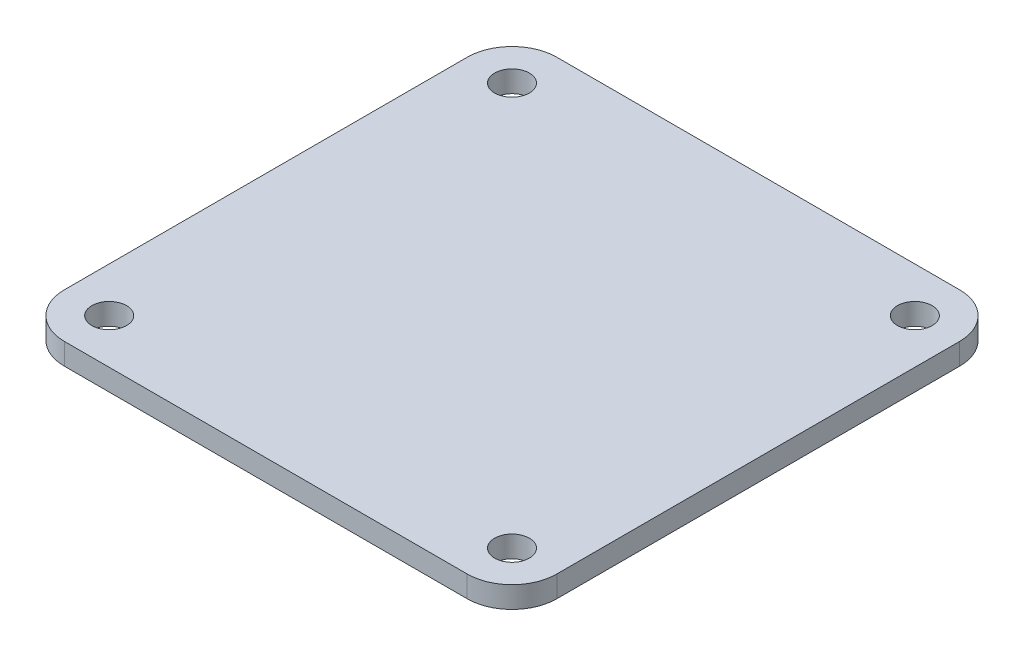
ISO-10303-21;
HEADER;
FILE_DESCRIPTION(('STEP AP214'),'2;1');
FILE_NAME('part.step','',(''),(''),'','','');
FILE_SCHEMA(('AUTOMOTIVE_DESIGN { 1 0 10303 214 1 1 1 1 }'));
ENDSEC;
DATA;
#1=APPLICATION_CONTEXT('core data for automotive mechanical design processes');
#2=APPLICATION_PROTOCOL_DEFINITION('international standard','automotive_design',2000,#1);
#3=PRODUCT_CONTEXT('',#1,'mechanical');
#4=PRODUCT('Part','Part','',(#3));
#5=PRODUCT_RELATED_PRODUCT_CATEGORY('part','',(#4));
#6=PRODUCT_DEFINITION_FORMATION('','',#4);
#7=PRODUCT_DEFINITION_CONTEXT('part definition',#1,'design');
#8=PRODUCT_DEFINITION('design','',#6,#7);
#9=PRODUCT_DEFINITION_SHAPE('','',#8);
#10=(LENGTH_UNIT() NAMED_UNIT(*) SI_UNIT(.MILLI.,.METRE.));
#11=(NAMED_UNIT(*) PLANE_ANGLE_UNIT() SI_UNIT($,.RADIAN.));
#12=(NAMED_UNIT(*) SI_UNIT($,.STERADIAN.) SOLID_ANGLE_UNIT());
#13=UNCERTAINTY_MEASURE_WITH_UNIT(LENGTH_MEASURE(1.E-05),#10,'distance_accuracy_value','');
#14=(GEOMETRIC_REPRESENTATION_CONTEXT(3) GLOBAL_UNCERTAINTY_ASSIGNED_CONTEXT((#13)) GLOBAL_UNIT_ASSIGNED_CONTEXT((#10,
#11,#12)) REPRESENTATION_CONTEXT('',''));
#15=CARTESIAN_POINT('',(0.,0.,0.));
#16=DIRECTION('',(0.,0.,1.));
#17=DIRECTION('',(1.,0.,0.));
#18=AXIS2_PLACEMENT_3D('',#15,#16,#17);
#19=CARTESIAN_POINT('',(0.,3.048,0.));
#20=DIRECTION('',(1.,0.,0.));
#21=DIRECTION('',(0.,0.,-1.));
#22=AXIS2_PLACEMENT_3D('',#19,#20,#21);
#23=PLANE('',#22);
#24=DIRECTION('',(0.,0.,1.));
#25=VECTOR('',#24,1.);
#26=CARTESIAN_POINT('',(0.,3.048,0.));
#27=LINE('',#26,#25);
#28=CARTESIAN_POINT('',(0.,3.048,-63.5));
#29=VERTEX_POINT('',#28);
#30=CARTESIAN_POINT('',(0.,3.048,-6.35));
#31=VERTEX_POINT('',#30);
#32=EDGE_CURVE('E117',#29,#31,#27,.T.);
#33=ORIENTED_EDGE('',*,*,#32,.F.);
#34=DIRECTION('',(0.,-1.,0.));
#35=VECTOR('',#34,1.);
#36=CARTESIAN_POINT('',(0.,3.048,-63.5));
#37=LINE('',#36,#35);
#38=CARTESIAN_POINT('',(0.,0.,-63.5));
#39=VERTEX_POINT('',#38);
#40=EDGE_CURVE('E102',#29,#39,#37,.T.);
#41=ORIENTED_EDGE('',*,*,#40,.T.);
#42=DIRECTION('',(0.,0.,1.));
#43=VECTOR('',#42,1.);
#44=CARTESIAN_POINT('',(0.,0.,0.));
#45=LINE('',#44,#43);
#46=CARTESIAN_POINT('',(0.,0.,-6.35));
#47=VERTEX_POINT('',#46);
#48=EDGE_CURVE('E114',#39,#47,#45,.T.);
#49=ORIENTED_EDGE('',*,*,#48,.T.);
#50=DIRECTION('',(0.,-1.,0.));
#51=VECTOR('',#50,1.);
#52=CARTESIAN_POINT('',(0.,3.048,-6.35));
#53=LINE('',#52,#51);
#54=EDGE_CURVE('E119',#47,#31,#53,.F.);
#55=ORIENTED_EDGE('',*,*,#54,.T.);
#56=EDGE_LOOP('',(#33,#41,#49,#55));
#57=FACE_BOUND('',#56,.T.);
#58=ADVANCED_FACE('F33',(#57),#23,.F.);
#59=CARTESIAN_POINT('',(0.,3.048,0.));
#60=DIRECTION('',(0.,0.,-1.));
#61=DIRECTION('',(-1.,0.,0.));
#62=AXIS2_PLACEMENT_3D('',#59,#60,#61);
#63=PLANE('',#62);
#64=DIRECTION('',(1.,0.,0.));
#65=VECTOR('',#64,1.);
#66=CARTESIAN_POINT('',(0.,3.048,0.));
#67=LINE('',#66,#65);
#68=CARTESIAN_POINT('',(6.35,3.048,0.));
#69=VERTEX_POINT('',#68);
#70=CARTESIAN_POINT('',(63.5,3.048,0.));
#71=VERTEX_POINT('',#70);
#72=EDGE_CURVE('E172',#69,#71,#67,.T.);
#73=ORIENTED_EDGE('',*,*,#72,.F.);
#74=DIRECTION('',(0.,-1.,0.));
#75=VECTOR('',#74,1.);
#76=CARTESIAN_POINT('',(6.35,3.048,0.));
#77=LINE('',#76,#75);
#78=CARTESIAN_POINT('',(6.35,0.,0.));
#79=VERTEX_POINT('',#78);
#80=EDGE_CURVE('E156',#69,#79,#77,.T.);
#81=ORIENTED_EDGE('',*,*,#80,.T.);
#82=DIRECTION('',(1.,0.,0.));
#83=VECTOR('',#82,1.);
#84=CARTESIAN_POINT('',(0.,0.,0.));
#85=LINE('',#84,#83);
#86=CARTESIAN_POINT('',(63.5,0.,0.));
#87=VERTEX_POINT('',#86);
#88=EDGE_CURVE('E123',#79,#87,#85,.T.);
#89=ORIENTED_EDGE('',*,*,#88,.T.);
#90=DIRECTION('',(0.,-1.,0.));
#91=VECTOR('',#90,1.);
#92=CARTESIAN_POINT('',(63.5,3.048,0.));
#93=LINE('',#92,#91);
#94=EDGE_CURVE('E154',#87,#71,#93,.F.);
#95=ORIENTED_EDGE('',*,*,#94,.T.);
#96=EDGE_LOOP('',(#73,#81,#89,#95));
#97=FACE_BOUND('',#96,.T.);
#98=ADVANCED_FACE('F221',(#97),#63,.F.);
#99=CARTESIAN_POINT('',(69.85,3.048,0.));
#100=DIRECTION('',(-1.,0.,0.));
#101=DIRECTION('',(0.,0.,1.));
#102=AXIS2_PLACEMENT_3D('',#99,#100,#101);
#103=PLANE('',#102);
#104=DIRECTION('',(0.,0.,-1.));
#105=VECTOR('',#104,1.);
#106=CARTESIAN_POINT('',(69.85,0.,0.));
#107=LINE('',#106,#105);
#108=CARTESIAN_POINT('',(69.85,0.,-6.35));
#109=VERTEX_POINT('',#108);
#110=CARTESIAN_POINT('',(69.85,0.,-63.5));
#111=VERTEX_POINT('',#110);
#112=EDGE_CURVE('E127',#109,#111,#107,.T.);
#113=ORIENTED_EDGE('',*,*,#112,.T.);
#114=DIRECTION('',(0.,-1.,0.));
#115=VECTOR('',#114,1.);
#116=CARTESIAN_POINT('',(69.85,3.048,-63.5));
#117=LINE('',#116,#115);
#118=CARTESIAN_POINT('',(69.85,3.048,-63.5));
#119=VERTEX_POINT('',#118);
#120=EDGE_CURVE('E11',#111,#119,#117,.F.);
#121=ORIENTED_EDGE('',*,*,#120,.T.);
#122=DIRECTION('',(0.,0.,-1.));
#123=VECTOR('',#122,1.);
#124=CARTESIAN_POINT('',(69.85,3.048,0.));
#125=LINE('',#124,#123);
#126=CARTESIAN_POINT('',(69.85,3.048,-6.35));
#127=VERTEX_POINT('',#126);
#128=EDGE_CURVE('E162',#127,#119,#125,.T.);
#129=ORIENTED_EDGE('',*,*,#128,.F.);
#130=DIRECTION('',(0.,-1.,0.));
#131=VECTOR('',#130,1.);
#132=CARTESIAN_POINT('',(69.85,3.048,-6.35));
#133=LINE('',#132,#131);
#134=EDGE_CURVE('E41',#127,#109,#133,.T.);
#135=ORIENTED_EDGE('',*,*,#134,.T.);
#136=EDGE_LOOP('',(#113,#121,#129,#135));
#137=FACE_BOUND('',#136,.T.);
#138=ADVANCED_FACE('F161',(#137),#103,.F.);
#139=CARTESIAN_POINT('',(0.,3.048,-69.85));
#140=DIRECTION('',(0.,0.,1.));
#141=DIRECTION('',(1.,0.,0.));
#142=AXIS2_PLACEMENT_3D('',#139,#140,#141);
#143=PLANE('',#142);
#144=DIRECTION('',(-1.,0.,0.));
#145=VECTOR('',#144,1.);
#146=CARTESIAN_POINT('',(0.,0.,-69.85));
#147=LINE('',#146,#145);
#148=CARTESIAN_POINT('',(63.5,0.,-69.85));
#149=VERTEX_POINT('',#148);
#150=CARTESIAN_POINT('',(6.35,0.,-69.85));
#151=VERTEX_POINT('',#150);
#152=EDGE_CURVE('E137',#149,#151,#147,.T.);
#153=ORIENTED_EDGE('',*,*,#152,.T.);
#154=DIRECTION('',(0.,-1.,0.));
#155=VECTOR('',#154,1.);
#156=CARTESIAN_POINT('',(6.35,3.048,-69.85));
#157=LINE('',#156,#155);
#158=CARTESIAN_POINT('',(6.35,3.048,-69.85));
#159=VERTEX_POINT('',#158);
#160=EDGE_CURVE('E103',#151,#159,#157,.F.);
#161=ORIENTED_EDGE('',*,*,#160,.T.);
#162=DIRECTION('',(-1.,0.,0.));
#163=VECTOR('',#162,1.);
#164=CARTESIAN_POINT('',(0.,3.048,-69.85));
#165=LINE('',#164,#163);
#166=CARTESIAN_POINT('',(63.5,3.048,-69.85));
#167=VERTEX_POINT('',#166);
#168=EDGE_CURVE('E133',#167,#159,#165,.T.);
#169=ORIENTED_EDGE('',*,*,#168,.F.);
#170=DIRECTION('',(0.,-1.,0.));
#171=VECTOR('',#170,1.);
#172=CARTESIAN_POINT('',(63.5,3.048,-69.85));
#173=LINE('',#172,#171);
#174=EDGE_CURVE('E108',#167,#149,#173,.T.);
#175=ORIENTED_EDGE('',*,*,#174,.T.);
#176=EDGE_LOOP('',(#153,#161,#169,#175));
#177=FACE_BOUND('',#176,.T.);
#178=ADVANCED_FACE('F170',(#177),#143,.F.);
#179=CARTESIAN_POINT('',(0.,3.048,0.));
#180=DIRECTION('',(0.,-1.,0.));
#181=DIRECTION('',(0.,0.,-1.));
#182=AXIS2_PLACEMENT_3D('',#179,#180,#181);
#183=PLANE('',#182);
#184=CARTESIAN_POINT('',(63.5,3.048,-6.35));
#185=DIRECTION('',(0.,1.,0.));
#186=DIRECTION('',(0.,0.,1.));
#187=AXIS2_PLACEMENT_3D('',#184,#185,#186);
#188=CIRCLE('',#187,2.45998999999999);
#189=CARTESIAN_POINT('',(63.5,3.048,-8.80998999999999));
#190=VERTEX_POINT('',#189);
#191=EDGE_CURVE('E177',#190,#190,#188,.T.);
#192=ORIENTED_EDGE('',*,*,#191,.F.);
#193=EDGE_LOOP('',(#192));
#194=FACE_BOUND('',#193,.T.);
#195=CARTESIAN_POINT('',(6.35,3.048,-63.5));
#196=DIRECTION('',(0.,1.,0.));
#197=DIRECTION('',(0.,0.,1.));
#198=AXIS2_PLACEMENT_3D('',#195,#196,#197);
#199=CIRCLE('',#198,2.45999);
#200=CARTESIAN_POINT('',(6.35,3.048,-65.95999));
#201=VERTEX_POINT('',#200);
#202=EDGE_CURVE('E182',#201,#201,#199,.T.);
#203=ORIENTED_EDGE('',*,*,#202,.F.);
#204=EDGE_LOOP('',(#203));
#205=FACE_BOUND('',#204,.T.);
#206=CARTESIAN_POINT('',(63.5,3.048,-63.5));
#207=DIRECTION('',(0.,1.,0.));
#208=DIRECTION('',(0.,0.,1.));
#209=AXIS2_PLACEMENT_3D('',#206,#207,#208);
#210=CIRCLE('',#209,2.45998999999999);
#211=CARTESIAN_POINT('',(63.5,3.048,-65.95999));
#212=VERTEX_POINT('',#211);
#213=EDGE_CURVE('E183',#212,#212,#210,.T.);
#214=ORIENTED_EDGE('',*,*,#213,.F.);
#215=EDGE_LOOP('',(#214));
#216=FACE_BOUND('',#215,.T.);
#217=CARTESIAN_POINT('',(6.35,3.048,-6.35));
#218=DIRECTION('',(0.,1.,0.));
#219=DIRECTION('',(0.,0.,1.));
#220=AXIS2_PLACEMENT_3D('',#217,#218,#219);
#221=CIRCLE('',#220,2.45999);
#222=CARTESIAN_POINT('',(6.35,3.048,-8.80999));
#223=VERTEX_POINT('',#222);
#224=EDGE_CURVE('E124',#223,#223,#221,.T.);
#225=ORIENTED_EDGE('',*,*,#224,.F.);
#226=EDGE_LOOP('',(#225));
#227=FACE_BOUND('',#226,.T.);
#228=ORIENTED_EDGE('',*,*,#168,.T.);
#229=CARTESIAN_POINT('',(6.35,3.048,-63.5));
#230=DIRECTION('',(0.,-1.,0.));
#231=DIRECTION('',(0.,0.,-1.));
#232=AXIS2_PLACEMENT_3D('',#229,#230,#231);
#233=CIRCLE('',#232,6.35);
#234=EDGE_CURVE('E152',#159,#29,#233,.F.);
#235=ORIENTED_EDGE('',*,*,#234,.T.);
#236=ORIENTED_EDGE('',*,*,#32,.T.);
#237=CARTESIAN_POINT('',(6.35,3.048,-6.35));
#238=DIRECTION('',(0.,-1.,0.));
#239=DIRECTION('',(0.,0.,-1.));
#240=AXIS2_PLACEMENT_3D('',#237,#238,#239);
#241=CIRCLE('',#240,6.35);
#242=EDGE_CURVE('E150',#31,#69,#241,.F.);
#243=ORIENTED_EDGE('',*,*,#242,.T.);
#244=ORIENTED_EDGE('',*,*,#72,.T.);
#245=CARTESIAN_POINT('',(63.5,3.048,-6.35));
#246=DIRECTION('',(0.,-1.,0.));
#247=DIRECTION('',(0.,0.,-1.));
#248=AXIS2_PLACEMENT_3D('',#245,#246,#247);
#249=CIRCLE('',#248,6.35);
#250=EDGE_CURVE('E53',#71,#127,#249,.F.);
#251=ORIENTED_EDGE('',*,*,#250,.T.);
#252=ORIENTED_EDGE('',*,*,#128,.T.);
#253=CARTESIAN_POINT('',(63.5,3.048,-63.5));
#254=DIRECTION('',(0.,-1.,0.));
#255=DIRECTION('',(0.,0.,-1.));
#256=AXIS2_PLACEMENT_3D('',#253,#254,#255);
#257=CIRCLE('',#256,6.35);
#258=EDGE_CURVE('E148',#119,#167,#257,.F.);
#259=ORIENTED_EDGE('',*,*,#258,.T.);
#260=EDGE_LOOP('',(#228,#235,#236,#243,#244,#251,#252,#259));
#261=FACE_BOUND('',#260,.T.);
#262=ADVANCED_FACE('F200',(#194,#205,#216,#227,#261),#183,.F.);
#263=CARTESIAN_POINT('',(0.,0.,0.));
#264=DIRECTION('',(0.,-1.,0.));
#265=DIRECTION('',(0.,0.,-1.));
#266=AXIS2_PLACEMENT_3D('',#263,#264,#265);
#267=PLANE('',#266);
#268=CARTESIAN_POINT('',(63.5,0.,-6.35));
#269=DIRECTION('',(0.,1.,0.));
#270=DIRECTION('',(0.,0.,1.));
#271=AXIS2_PLACEMENT_3D('',#268,#269,#270);
#272=CIRCLE('',#271,2.45998999999999);
#273=CARTESIAN_POINT('',(63.5,0.,-8.80998999999999));
#274=VERTEX_POINT('',#273);
#275=EDGE_CURVE('E186',#274,#274,#272,.T.);
#276=ORIENTED_EDGE('',*,*,#275,.T.);
#277=EDGE_LOOP('',(#276));
#278=FACE_BOUND('',#277,.T.);
#279=CARTESIAN_POINT('',(6.35,0.,-63.5));
#280=DIRECTION('',(0.,1.,0.));
#281=DIRECTION('',(0.,0.,1.));
#282=AXIS2_PLACEMENT_3D('',#279,#280,#281);
#283=CIRCLE('',#282,2.45999);
#284=CARTESIAN_POINT('',(6.35,0.,-65.95999));
#285=VERTEX_POINT('',#284);
#286=EDGE_CURVE('E179',#285,#285,#283,.T.);
#287=ORIENTED_EDGE('',*,*,#286,.T.);
#288=EDGE_LOOP('',(#287));
#289=FACE_BOUND('',#288,.T.);
#290=CARTESIAN_POINT('',(63.5,0.,-63.5));
#291=DIRECTION('',(0.,1.,0.));
#292=DIRECTION('',(0.,0.,1.));
#293=AXIS2_PLACEMENT_3D('',#290,#291,#292);
#294=CIRCLE('',#293,2.45998999999999);
#295=CARTESIAN_POINT('',(63.5,0.,-65.95999));
#296=VERTEX_POINT('',#295);
#297=EDGE_CURVE('E191',#296,#296,#294,.T.);
#298=ORIENTED_EDGE('',*,*,#297,.T.);
#299=EDGE_LOOP('',(#298));
#300=FACE_BOUND('',#299,.T.);
#301=CARTESIAN_POINT('',(6.35,0.,-6.35));
#302=DIRECTION('',(0.,1.,0.));
#303=DIRECTION('',(0.,0.,1.));
#304=AXIS2_PLACEMENT_3D('',#301,#302,#303);
#305=CIRCLE('',#304,2.45999);
#306=CARTESIAN_POINT('',(6.35,0.,-8.80999));
#307=VERTEX_POINT('',#306);
#308=EDGE_CURVE('E130',#307,#307,#305,.T.);
#309=ORIENTED_EDGE('',*,*,#308,.T.);
#310=EDGE_LOOP('',(#309));
#311=FACE_BOUND('',#310,.T.);
#312=ORIENTED_EDGE('',*,*,#48,.F.);
#313=CARTESIAN_POINT('',(6.35,0.,-63.5));
#314=DIRECTION('',(0.,-1.,0.));
#315=DIRECTION('',(0.,0.,-1.));
#316=AXIS2_PLACEMENT_3D('',#313,#314,#315);
#317=CIRCLE('',#316,6.35);
#318=EDGE_CURVE('E98',#39,#151,#317,.T.);
#319=ORIENTED_EDGE('',*,*,#318,.T.);
#320=ORIENTED_EDGE('',*,*,#152,.F.);
#321=CARTESIAN_POINT('',(63.5,0.,-63.5));
#322=DIRECTION('',(0.,-1.,0.));
#323=DIRECTION('',(0.,0.,-1.));
#324=AXIS2_PLACEMENT_3D('',#321,#322,#323);
#325=CIRCLE('',#324,6.35);
#326=EDGE_CURVE('E141',#149,#111,#325,.T.);
#327=ORIENTED_EDGE('',*,*,#326,.T.);
#328=ORIENTED_EDGE('',*,*,#112,.F.);
#329=CARTESIAN_POINT('',(63.5,0.,-6.35));
#330=DIRECTION('',(0.,-1.,0.));
#331=DIRECTION('',(0.,0.,-1.));
#332=AXIS2_PLACEMENT_3D('',#329,#330,#331);
#333=CIRCLE('',#332,6.35);
#334=EDGE_CURVE('E118',#109,#87,#333,.T.);
#335=ORIENTED_EDGE('',*,*,#334,.T.);
#336=ORIENTED_EDGE('',*,*,#88,.F.);
#337=CARTESIAN_POINT('',(6.35,0.,-6.35));
#338=DIRECTION('',(0.,-1.,0.));
#339=DIRECTION('',(0.,0.,-1.));
#340=AXIS2_PLACEMENT_3D('',#337,#338,#339);
#341=CIRCLE('',#340,6.35);
#342=EDGE_CURVE('E109',#79,#47,#341,.T.);
#343=ORIENTED_EDGE('',*,*,#342,.T.);
#344=EDGE_LOOP('',(#312,#319,#320,#327,#328,#335,#336,#343));
#345=FACE_BOUND('',#344,.T.);
#346=ADVANCED_FACE('F121',(#278,#289,#300,#311,#345),#267,.T.);
#347=CARTESIAN_POINT('',(6.35,3.048,-6.35));
#348=DIRECTION('',(0.,-1.,0.));
#349=DIRECTION('',(0.,0.,-1.));
#350=AXIS2_PLACEMENT_3D('',#347,#348,#349);
#351=CYLINDRICAL_SURFACE('',#350,2.45999);
#352=CARTESIAN_POINT('',(6.35,3.048,-8.80999));
#353=CARTESIAN_POINT('',(6.35,3.01625,-8.80999));
#354=CARTESIAN_POINT('',(6.35,2.9845,-8.80999));
#355=CARTESIAN_POINT('',(6.35,2.921,-8.80999));
#356=CARTESIAN_POINT('',(6.35,2.88925,-8.80999));
#357=CARTESIAN_POINT('',(6.35,2.82575,-8.80999));
#358=CARTESIAN_POINT('',(6.35,2.794,-8.80999));
#359=CARTESIAN_POINT('',(6.35,2.7305,-8.80999));
#360=CARTESIAN_POINT('',(6.35,2.69875,-8.80999));
#361=CARTESIAN_POINT('',(6.35,2.63525,-8.80999));
#362=CARTESIAN_POINT('',(6.35,2.6035,-8.80999));
#363=CARTESIAN_POINT('',(6.35,2.54,-8.80999));
#364=CARTESIAN_POINT('',(6.35,2.50825,-8.80999));
#365=CARTESIAN_POINT('',(6.35,2.44475,-8.80999));
#366=CARTESIAN_POINT('',(6.35,2.413,-8.80999));
#367=CARTESIAN_POINT('',(6.35,2.3495,-8.80999));
#368=CARTESIAN_POINT('',(6.35,2.31775,-8.80999));
#369=CARTESIAN_POINT('',(6.35,2.25425,-8.80999));
#370=CARTESIAN_POINT('',(6.35,2.2225,-8.80999));
#371=CARTESIAN_POINT('',(6.35,2.159,-8.80999));
#372=CARTESIAN_POINT('',(6.35,2.12725,-8.80999));
#373=CARTESIAN_POINT('',(6.35,2.06375,-8.80999));
#374=CARTESIAN_POINT('',(6.35,2.032,-8.80999));
#375=CARTESIAN_POINT('',(6.35,1.9685,-8.80999));
#376=CARTESIAN_POINT('',(6.35,1.93675,-8.80999));
#377=CARTESIAN_POINT('',(6.35,1.87325,-8.80999));
#378=CARTESIAN_POINT('',(6.35,1.8415,-8.80999));
#379=CARTESIAN_POINT('',(6.35,1.778,-8.80999));
#380=CARTESIAN_POINT('',(6.35,1.74625,-8.80999));
#381=CARTESIAN_POINT('',(6.35,1.68275,-8.80999));
#382=CARTESIAN_POINT('',(6.35,1.651,-8.80999));
#383=CARTESIAN_POINT('',(6.35,1.5875,-8.80999));
#384=CARTESIAN_POINT('',(6.35,1.55575,-8.80999));
#385=CARTESIAN_POINT('',(6.35,1.49225,-8.80999));
#386=CARTESIAN_POINT('',(6.35,1.4605,-8.80999));
#387=CARTESIAN_POINT('',(6.35,1.397,-8.80999));
#388=CARTESIAN_POINT('',(6.35,1.36525,-8.80999));
#389=CARTESIAN_POINT('',(6.35,1.30175,-8.80999));
#390=CARTESIAN_POINT('',(6.35,1.27,-8.80999));
#391=CARTESIAN_POINT('',(6.35,1.2065,-8.80999));
#392=CARTESIAN_POINT('',(6.35,1.17475,-8.80999));
#393=CARTESIAN_POINT('',(6.35,1.11125,-8.80999));
#394=CARTESIAN_POINT('',(6.35,1.0795,-8.80999));
#395=CARTESIAN_POINT('',(6.35,1.016,-8.80999));
#396=CARTESIAN_POINT('',(6.35,0.98425,-8.80999));
#397=CARTESIAN_POINT('',(6.35,0.92075,-8.80999));
#398=CARTESIAN_POINT('',(6.35,0.889,-8.80999));
#399=CARTESIAN_POINT('',(6.35,0.8255,-8.80999));
#400=CARTESIAN_POINT('',(6.35,0.79375,-8.80999));
#401=CARTESIAN_POINT('',(6.35,0.73025,-8.80999));
#402=CARTESIAN_POINT('',(6.35,0.6985,-8.80999));
#403=CARTESIAN_POINT('',(6.35,0.635,-8.80999));
#404=CARTESIAN_POINT('',(6.35,0.60325,-8.80999));
#405=CARTESIAN_POINT('',(6.35,0.53975,-8.80999));
#406=CARTESIAN_POINT('',(6.35,0.508,-8.80999));
#407=CARTESIAN_POINT('',(6.35,0.4445,-8.80999));
#408=CARTESIAN_POINT('',(6.35,0.41275,-8.80999));
#409=CARTESIAN_POINT('',(6.35,0.34925,-8.80999));
#410=CARTESIAN_POINT('',(6.35,0.3175,-8.80999));
#411=CARTESIAN_POINT('',(6.35,0.254,-8.80999));
#412=CARTESIAN_POINT('',(6.35,0.22225,-8.80999));
#413=CARTESIAN_POINT('',(6.35,0.15875,-8.80999));
#414=CARTESIAN_POINT('',(6.35,0.127,-8.80999));
#415=CARTESIAN_POINT('',(6.35,0.0634999999999999,-8.80999));
#416=CARTESIAN_POINT('',(6.35,0.03175,-8.80999));
#417=CARTESIAN_POINT('',(6.35,0.,-8.80999));
#418=B_SPLINE_CURVE_WITH_KNOTS('',3,(#352,#353,#354,#355,#356,#357,#358,#359,#360,#361,#362,
#363,#364,#365,#366,#367,#368,#369,#370,#371,#372,#373,#374,#375,#376,#377,#378,#379,#380,#381,
#382,#383,#384,#385,#386,#387,#388,#389,#390,#391,#392,#393,#394,#395,#396,#397,#398,#399,#400,
#401,#402,#403,#404,#405,#406,#407,#408,#409,#410,#411,#412,#413,#414,#415,#416,#417),
.UNSPECIFIED.,.F.,.F.,(4,2,2,2,2,2,2,2,2,2,2,2,2,2,2,2,2,2,2,2,2,2,2,2,2,2,2,2,2,2,2,2,4),(0.,
0.0952499999999998,0.1905,0.28575,0.381,0.47625,0.5715,0.66675,0.762,0.85725,0.9525,1.04775,
1.143,1.23825,1.3335,1.42875,1.524,1.61925,1.7145,1.80975,1.905,2.00025,2.0955,2.19075,2.286,
2.38125,2.4765,2.57175,2.667,2.76225,2.8575,2.95275,3.048),.UNSPECIFIED.);
#419=EDGE_CURVE('BSEAM207',#223,#307,#418,.T.);
#420=ORIENTED_EDGE('',*,*,#224,.T.);
#421=ORIENTED_EDGE('',*,*,#308,.F.);
#422=ORIENTED_EDGE('',*,*,#419,.T.);
#423=ORIENTED_EDGE('',*,*,#419,.F.);
#424=EDGE_LOOP('',(#420,#422,#421,#423));
#425=FACE_BOUND('',#424,.T.);
#426=ADVANCED_FACE('F207',(#425),#351,.F.);
#427=CARTESIAN_POINT('',(63.5,3.048,-63.5));
#428=DIRECTION('',(0.,-1.,0.));
#429=DIRECTION('',(0.,0.,-1.));
#430=AXIS2_PLACEMENT_3D('',#427,#428,#429);
#431=CYLINDRICAL_SURFACE('',#430,2.45998999999999);
#432=CARTESIAN_POINT('',(63.5,3.048,-65.95999));
#433=CARTESIAN_POINT('',(63.5,3.01625,-65.95999));
#434=CARTESIAN_POINT('',(63.5,2.9845,-65.95999));
#435=CARTESIAN_POINT('',(63.5,2.921,-65.95999));
#436=CARTESIAN_POINT('',(63.5,2.88925,-65.95999));
#437=CARTESIAN_POINT('',(63.5,2.82575,-65.95999));
#438=CARTESIAN_POINT('',(63.5,2.794,-65.95999));
#439=CARTESIAN_POINT('',(63.5,2.7305,-65.95999));
#440=CARTESIAN_POINT('',(63.5,2.69875,-65.95999));
#441=CARTESIAN_POINT('',(63.5,2.63525,-65.95999));
#442=CARTESIAN_POINT('',(63.5,2.6035,-65.95999));
#443=CARTESIAN_POINT('',(63.5,2.54,-65.95999));
#444=CARTESIAN_POINT('',(63.5,2.50825,-65.95999));
#445=CARTESIAN_POINT('',(63.5,2.44475,-65.95999));
#446=CARTESIAN_POINT('',(63.5,2.413,-65.95999));
#447=CARTESIAN_POINT('',(63.5,2.3495,-65.95999));
#448=CARTESIAN_POINT('',(63.5,2.31775,-65.95999));
#449=CARTESIAN_POINT('',(63.5,2.25425,-65.95999));
#450=CARTESIAN_POINT('',(63.5,2.2225,-65.95999));
#451=CARTESIAN_POINT('',(63.5,2.159,-65.95999));
#452=CARTESIAN_POINT('',(63.5,2.12725,-65.95999));
#453=CARTESIAN_POINT('',(63.5,2.06375,-65.95999));
#454=CARTESIAN_POINT('',(63.5,2.032,-65.95999));
#455=CARTESIAN_POINT('',(63.5,1.9685,-65.95999));
#456=CARTESIAN_POINT('',(63.5,1.93675,-65.95999));
#457=CARTESIAN_POINT('',(63.5,1.87325,-65.95999));
#458=CARTESIAN_POINT('',(63.5,1.8415,-65.95999));
#459=CARTESIAN_POINT('',(63.5,1.778,-65.95999));
#460=CARTESIAN_POINT('',(63.5,1.74625,-65.95999));
#461=CARTESIAN_POINT('',(63.5,1.68275,-65.95999));
#462=CARTESIAN_POINT('',(63.5,1.651,-65.95999));
#463=CARTESIAN_POINT('',(63.5,1.5875,-65.95999));
#464=CARTESIAN_POINT('',(63.5,1.55575,-65.95999));
#465=CARTESIAN_POINT('',(63.5,1.49225,-65.95999));
#466=CARTESIAN_POINT('',(63.5,1.4605,-65.95999));
#467=CARTESIAN_POINT('',(63.5,1.397,-65.95999));
#468=CARTESIAN_POINT('',(63.5,1.36525,-65.95999));
#469=CARTESIAN_POINT('',(63.5,1.30175,-65.95999));
#470=CARTESIAN_POINT('',(63.5,1.27,-65.95999));
#471=CARTESIAN_POINT('',(63.5,1.2065,-65.95999));
#472=CARTESIAN_POINT('',(63.5,1.17475,-65.95999));
#473=CARTESIAN_POINT('',(63.5,1.11125,-65.95999));
#474=CARTESIAN_POINT('',(63.5,1.0795,-65.95999));
#475=CARTESIAN_POINT('',(63.5,1.016,-65.95999));
#476=CARTESIAN_POINT('',(63.5,0.98425,-65.95999));
#477=CARTESIAN_POINT('',(63.5,0.92075,-65.95999));
#478=CARTESIAN_POINT('',(63.5,0.889,-65.95999));
#479=CARTESIAN_POINT('',(63.5,0.8255,-65.95999));
#480=CARTESIAN_POINT('',(63.5,0.79375,-65.95999));
#481=CARTESIAN_POINT('',(63.5,0.73025,-65.95999));
#482=CARTESIAN_POINT('',(63.5,0.6985,-65.95999));
#483=CARTESIAN_POINT('',(63.5,0.635,-65.95999));
#484=CARTESIAN_POINT('',(63.5,0.60325,-65.95999));
#485=CARTESIAN_POINT('',(63.5,0.53975,-65.95999));
#486=CARTESIAN_POINT('',(63.5,0.508,-65.95999));
#487=CARTESIAN_POINT('',(63.5,0.4445,-65.95999));
#488=CARTESIAN_POINT('',(63.5,0.41275,-65.95999));
#489=CARTESIAN_POINT('',(63.5,0.34925,-65.95999));
#490=CARTESIAN_POINT('',(63.5,0.3175,-65.95999));
#491=CARTESIAN_POINT('',(63.5,0.254,-65.95999));
#492=CARTESIAN_POINT('',(63.5,0.22225,-65.95999));
#493=CARTESIAN_POINT('',(63.5,0.15875,-65.95999));
#494=CARTESIAN_POINT('',(63.5,0.127,-65.95999));
#495=CARTESIAN_POINT('',(63.5,0.0634999999999999,-65.95999));
#496=CARTESIAN_POINT('',(63.5,0.03175,-65.95999));
#497=CARTESIAN_POINT('',(63.5,0.,-65.95999));
#498=B_SPLINE_CURVE_WITH_KNOTS('',3,(#432,#433,#434,#435,#436,#437,#438,#439,#440,#441,#442,
#443,#444,#445,#446,#447,#448,#449,#450,#451,#452,#453,#454,#455,#456,#457,#458,#459,#460,#461,
#462,#463,#464,#465,#466,#467,#468,#469,#470,#471,#472,#473,#474,#475,#476,#477,#478,#479,#480,
#481,#482,#483,#484,#485,#486,#487,#488,#489,#490,#491,#492,#493,#494,#495,#496,#497),
.UNSPECIFIED.,.F.,.F.,(4,2,2,2,2,2,2,2,2,2,2,2,2,2,2,2,2,2,2,2,2,2,2,2,2,2,2,2,2,2,2,2,4),(0.,
0.0952499999999998,0.1905,0.28575,0.381,0.47625,0.5715,0.66675,0.762,0.85725,0.9525,1.04775,
1.143,1.23825,1.3335,1.42875,1.524,1.61925,1.7145,1.80975,1.905,2.00025,2.0955,2.19075,2.286,
2.38125,2.4765,2.57175,2.667,2.76225,2.8575,2.95275,3.048),.UNSPECIFIED.);
#499=EDGE_CURVE('BSEAM197',#212,#296,#498,.T.);
#500=ORIENTED_EDGE('',*,*,#213,.T.);
#501=ORIENTED_EDGE('',*,*,#297,.F.);
#502=ORIENTED_EDGE('',*,*,#499,.T.);
#503=ORIENTED_EDGE('',*,*,#499,.F.);
#504=EDGE_LOOP('',(#500,#502,#501,#503));
#505=FACE_BOUND('',#504,.T.);
#506=ADVANCED_FACE('F197',(#505),#431,.F.);
#507=CARTESIAN_POINT('',(6.35,3.048,-63.5));
#508=DIRECTION('',(0.,-1.,0.));
#509=DIRECTION('',(0.,0.,-1.));
#510=AXIS2_PLACEMENT_3D('',#507,#508,#509);
#511=CYLINDRICAL_SURFACE('',#510,2.45999);
#512=CARTESIAN_POINT('',(6.35,3.048,-65.95999));
#513=CARTESIAN_POINT('',(6.35,3.01625,-65.95999));
#514=CARTESIAN_POINT('',(6.35,2.9845,-65.95999));
#515=CARTESIAN_POINT('',(6.35,2.921,-65.95999));
#516=CARTESIAN_POINT('',(6.35,2.88925,-65.95999));
#517=CARTESIAN_POINT('',(6.35,2.82575,-65.95999));
#518=CARTESIAN_POINT('',(6.35,2.794,-65.95999));
#519=CARTESIAN_POINT('',(6.35,2.7305,-65.95999));
#520=CARTESIAN_POINT('',(6.35,2.69875,-65.95999));
#521=CARTESIAN_POINT('',(6.35,2.63525,-65.95999));
#522=CARTESIAN_POINT('',(6.35,2.6035,-65.95999));
#523=CARTESIAN_POINT('',(6.35,2.54,-65.95999));
#524=CARTESIAN_POINT('',(6.35,2.50825,-65.95999));
#525=CARTESIAN_POINT('',(6.35,2.44475,-65.95999));
#526=CARTESIAN_POINT('',(6.35,2.413,-65.95999));
#527=CARTESIAN_POINT('',(6.35,2.3495,-65.95999));
#528=CARTESIAN_POINT('',(6.35,2.31775,-65.95999));
#529=CARTESIAN_POINT('',(6.35,2.25425,-65.95999));
#530=CARTESIAN_POINT('',(6.35,2.2225,-65.95999));
#531=CARTESIAN_POINT('',(6.35,2.159,-65.95999));
#532=CARTESIAN_POINT('',(6.35,2.12725,-65.95999));
#533=CARTESIAN_POINT('',(6.35,2.06375,-65.95999));
#534=CARTESIAN_POINT('',(6.35,2.032,-65.95999));
#535=CARTESIAN_POINT('',(6.35,1.9685,-65.95999));
#536=CARTESIAN_POINT('',(6.35,1.93675,-65.95999));
#537=CARTESIAN_POINT('',(6.35,1.87325,-65.95999));
#538=CARTESIAN_POINT('',(6.35,1.8415,-65.95999));
#539=CARTESIAN_POINT('',(6.35,1.778,-65.95999));
#540=CARTESIAN_POINT('',(6.35,1.74625,-65.95999));
#541=CARTESIAN_POINT('',(6.35,1.68275,-65.95999));
#542=CARTESIAN_POINT('',(6.35,1.651,-65.95999));
#543=CARTESIAN_POINT('',(6.35,1.5875,-65.95999));
#544=CARTESIAN_POINT('',(6.35,1.55575,-65.95999));
#545=CARTESIAN_POINT('',(6.35,1.49225,-65.95999));
#546=CARTESIAN_POINT('',(6.35,1.4605,-65.95999));
#547=CARTESIAN_POINT('',(6.35,1.397,-65.95999));
#548=CARTESIAN_POINT('',(6.35,1.36525,-65.95999));
#549=CARTESIAN_POINT('',(6.35,1.30175,-65.95999));
#550=CARTESIAN_POINT('',(6.35,1.27,-65.95999));
#551=CARTESIAN_POINT('',(6.35,1.2065,-65.95999));
#552=CARTESIAN_POINT('',(6.35,1.17475,-65.95999));
#553=CARTESIAN_POINT('',(6.35,1.11125,-65.95999));
#554=CARTESIAN_POINT('',(6.35,1.0795,-65.95999));
#555=CARTESIAN_POINT('',(6.35,1.016,-65.95999));
#556=CARTESIAN_POINT('',(6.35,0.98425,-65.95999));
#557=CARTESIAN_POINT('',(6.35,0.92075,-65.95999));
#558=CARTESIAN_POINT('',(6.35,0.889,-65.95999));
#559=CARTESIAN_POINT('',(6.35,0.8255,-65.95999));
#560=CARTESIAN_POINT('',(6.35,0.79375,-65.95999));
#561=CARTESIAN_POINT('',(6.35,0.73025,-65.95999));
#562=CARTESIAN_POINT('',(6.35,0.6985,-65.95999));
#563=CARTESIAN_POINT('',(6.35,0.635,-65.95999));
#564=CARTESIAN_POINT('',(6.35,0.60325,-65.95999));
#565=CARTESIAN_POINT('',(6.35,0.53975,-65.95999));
#566=CARTESIAN_POINT('',(6.35,0.508,-65.95999));
#567=CARTESIAN_POINT('',(6.35,0.4445,-65.95999));
#568=CARTESIAN_POINT('',(6.35,0.41275,-65.95999));
#569=CARTESIAN_POINT('',(6.35,0.34925,-65.95999));
#570=CARTESIAN_POINT('',(6.35,0.3175,-65.95999));
#571=CARTESIAN_POINT('',(6.35,0.254,-65.95999));
#572=CARTESIAN_POINT('',(6.35,0.22225,-65.95999));
#573=CARTESIAN_POINT('',(6.35,0.15875,-65.95999));
#574=CARTESIAN_POINT('',(6.35,0.127,-65.95999));
#575=CARTESIAN_POINT('',(6.35,0.0634999999999999,-65.95999));
#576=CARTESIAN_POINT('',(6.35,0.03175,-65.95999));
#577=CARTESIAN_POINT('',(6.35,0.,-65.95999));
#578=B_SPLINE_CURVE_WITH_KNOTS('',3,(#512,#513,#514,#515,#516,#517,#518,#519,#520,#521,#522,
#523,#524,#525,#526,#527,#528,#529,#530,#531,#532,#533,#534,#535,#536,#537,#538,#539,#540,#541,
#542,#543,#544,#545,#546,#547,#548,#549,#550,#551,#552,#553,#554,#555,#556,#557,#558,#559,#560,
#561,#562,#563,#564,#565,#566,#567,#568,#569,#570,#571,#572,#573,#574,#575,#576,#577),
.UNSPECIFIED.,.F.,.F.,(4,2,2,2,2,2,2,2,2,2,2,2,2,2,2,2,2,2,2,2,2,2,2,2,2,2,2,2,2,2,2,2,4),(0.,
0.0952499999999998,0.1905,0.28575,0.381,0.47625,0.5715,0.66675,0.762,0.85725,0.9525,1.04775,
1.143,1.23825,1.3335,1.42875,1.524,1.61925,1.7145,1.80975,1.905,2.00025,2.0955,2.19075,2.286,
2.38125,2.4765,2.57175,2.667,2.76225,2.8575,2.95275,3.048),.UNSPECIFIED.);
#579=EDGE_CURVE('BSEAM306',#201,#285,#578,.T.);
#580=ORIENTED_EDGE('',*,*,#202,.T.);
#581=ORIENTED_EDGE('',*,*,#286,.F.);
#582=ORIENTED_EDGE('',*,*,#579,.T.);
#583=ORIENTED_EDGE('',*,*,#579,.F.);
#584=EDGE_LOOP('',(#580,#582,#581,#583));
#585=FACE_BOUND('',#584,.T.);
#586=ADVANCED_FACE('F306',(#585),#511,.F.);
#587=CARTESIAN_POINT('',(63.5,3.048,-6.35));
#588=DIRECTION('',(0.,-1.,0.));
#589=DIRECTION('',(0.,0.,-1.));
#590=AXIS2_PLACEMENT_3D('',#587,#588,#589);
#591=CYLINDRICAL_SURFACE('',#590,2.45998999999999);
#592=CARTESIAN_POINT('',(63.5,3.048,-8.80998999999999));
#593=CARTESIAN_POINT('',(63.5,3.01625,-8.80998999999999));
#594=CARTESIAN_POINT('',(63.5,2.9845,-8.80998999999999));
#595=CARTESIAN_POINT('',(63.5,2.921,-8.80998999999999));
#596=CARTESIAN_POINT('',(63.5,2.88925,-8.80998999999999));
#597=CARTESIAN_POINT('',(63.5,2.82575,-8.80998999999999));
#598=CARTESIAN_POINT('',(63.5,2.794,-8.80998999999999));
#599=CARTESIAN_POINT('',(63.5,2.7305,-8.80998999999999));
#600=CARTESIAN_POINT('',(63.5,2.69875,-8.80998999999999));
#601=CARTESIAN_POINT('',(63.5,2.63525,-8.80998999999999));
#602=CARTESIAN_POINT('',(63.5,2.6035,-8.80998999999999));
#603=CARTESIAN_POINT('',(63.5,2.54,-8.80998999999999));
#604=CARTESIAN_POINT('',(63.5,2.50825,-8.80998999999999));
#605=CARTESIAN_POINT('',(63.5,2.44475,-8.80998999999999));
#606=CARTESIAN_POINT('',(63.5,2.413,-8.80998999999999));
#607=CARTESIAN_POINT('',(63.5,2.3495,-8.80998999999999));
#608=CARTESIAN_POINT('',(63.5,2.31775,-8.80998999999999));
#609=CARTESIAN_POINT('',(63.5,2.25425,-8.80998999999999));
#610=CARTESIAN_POINT('',(63.5,2.2225,-8.80998999999999));
#611=CARTESIAN_POINT('',(63.5,2.159,-8.80998999999999));
#612=CARTESIAN_POINT('',(63.5,2.12725,-8.80998999999999));
#613=CARTESIAN_POINT('',(63.5,2.06375,-8.80998999999999));
#614=CARTESIAN_POINT('',(63.5,2.032,-8.80998999999999));
#615=CARTESIAN_POINT('',(63.5,1.9685,-8.80998999999999));
#616=CARTESIAN_POINT('',(63.5,1.93675,-8.80998999999999));
#617=CARTESIAN_POINT('',(63.5,1.87325,-8.80998999999999));
#618=CARTESIAN_POINT('',(63.5,1.8415,-8.80998999999999));
#619=CARTESIAN_POINT('',(63.5,1.778,-8.80998999999999));
#620=CARTESIAN_POINT('',(63.5,1.74625,-8.80998999999999));
#621=CARTESIAN_POINT('',(63.5,1.68275,-8.80998999999999));
#622=CARTESIAN_POINT('',(63.5,1.651,-8.80998999999999));
#623=CARTESIAN_POINT('',(63.5,1.5875,-8.80998999999999));
#624=CARTESIAN_POINT('',(63.5,1.55575,-8.80998999999999));
#625=CARTESIAN_POINT('',(63.5,1.49225,-8.80998999999999));
#626=CARTESIAN_POINT('',(63.5,1.4605,-8.80998999999999));
#627=CARTESIAN_POINT('',(63.5,1.397,-8.80998999999999));
#628=CARTESIAN_POINT('',(63.5,1.36525,-8.80998999999999));
#629=CARTESIAN_POINT('',(63.5,1.30175,-8.80998999999999));
#630=CARTESIAN_POINT('',(63.5,1.27,-8.80998999999999));
#631=CARTESIAN_POINT('',(63.5,1.2065,-8.80998999999999));
#632=CARTESIAN_POINT('',(63.5,1.17475,-8.80998999999999));
#633=CARTESIAN_POINT('',(63.5,1.11125,-8.80998999999999));
#634=CARTESIAN_POINT('',(63.5,1.0795,-8.80998999999999));
#635=CARTESIAN_POINT('',(63.5,1.016,-8.80998999999999));
#636=CARTESIAN_POINT('',(63.5,0.98425,-8.80998999999999));
#637=CARTESIAN_POINT('',(63.5,0.92075,-8.80998999999999));
#638=CARTESIAN_POINT('',(63.5,0.889,-8.80998999999999));
#639=CARTESIAN_POINT('',(63.5,0.8255,-8.80998999999999));
#640=CARTESIAN_POINT('',(63.5,0.79375,-8.80998999999999));
#641=CARTESIAN_POINT('',(63.5,0.73025,-8.80998999999999));
#642=CARTESIAN_POINT('',(63.5,0.6985,-8.80998999999999));
#643=CARTESIAN_POINT('',(63.5,0.635,-8.80998999999999));
#644=CARTESIAN_POINT('',(63.5,0.60325,-8.80998999999999));
#645=CARTESIAN_POINT('',(63.5,0.53975,-8.80998999999999));
#646=CARTESIAN_POINT('',(63.5,0.508,-8.80998999999999));
#647=CARTESIAN_POINT('',(63.5,0.4445,-8.80998999999999));
#648=CARTESIAN_POINT('',(63.5,0.41275,-8.80998999999999));
#649=CARTESIAN_POINT('',(63.5,0.34925,-8.80998999999999));
#650=CARTESIAN_POINT('',(63.5,0.3175,-8.80998999999999));
#651=CARTESIAN_POINT('',(63.5,0.254,-8.80998999999999));
#652=CARTESIAN_POINT('',(63.5,0.22225,-8.80998999999999));
#653=CARTESIAN_POINT('',(63.5,0.15875,-8.80998999999999));
#654=CARTESIAN_POINT('',(63.5,0.127,-8.80998999999999));
#655=CARTESIAN_POINT('',(63.5,0.0634999999999999,-8.80998999999999));
#656=CARTESIAN_POINT('',(63.5,0.03175,-8.80998999999999));
#657=CARTESIAN_POINT('',(63.5,0.,-8.80998999999999));
#658=B_SPLINE_CURVE_WITH_KNOTS('',3,(#592,#593,#594,#595,#596,#597,#598,#599,#600,#601,#602,
#603,#604,#605,#606,#607,#608,#609,#610,#611,#612,#613,#614,#615,#616,#617,#618,#619,#620,#621,
#622,#623,#624,#625,#626,#627,#628,#629,#630,#631,#632,#633,#634,#635,#636,#637,#638,#639,#640,
#641,#642,#643,#644,#645,#646,#647,#648,#649,#650,#651,#652,#653,#654,#655,#656,#657),
.UNSPECIFIED.,.F.,.F.,(4,2,2,2,2,2,2,2,2,2,2,2,2,2,2,2,2,2,2,2,2,2,2,2,2,2,2,2,2,2,2,2,4),(0.,
0.0952499999999998,0.1905,0.28575,0.381,0.47625,0.5715,0.66675,0.762,0.85725,0.9525,1.04775,
1.143,1.23825,1.3335,1.42875,1.524,1.61925,1.7145,1.80975,1.905,2.00025,2.0955,2.19075,2.286,
2.38125,2.4765,2.57175,2.667,2.76225,2.8575,2.95275,3.048),.UNSPECIFIED.);
#659=EDGE_CURVE('BSEAM233',#190,#274,#658,.T.);
#660=ORIENTED_EDGE('',*,*,#191,.T.);
#661=ORIENTED_EDGE('',*,*,#275,.F.);
#662=ORIENTED_EDGE('',*,*,#659,.T.);
#663=ORIENTED_EDGE('',*,*,#659,.F.);
#664=EDGE_LOOP('',(#660,#662,#661,#663));
#665=FACE_BOUND('',#664,.T.);
#666=ADVANCED_FACE('F233',(#665),#591,.F.);
#667=CARTESIAN_POINT('',(6.35,3.048,-63.5));
#668=DIRECTION('',(0.,-1.,0.));
#669=DIRECTION('',(0.,0.,-1.));
#670=AXIS2_PLACEMENT_3D('',#667,#668,#669);
#671=CYLINDRICAL_SURFACE('',#670,6.35);
#672=ORIENTED_EDGE('',*,*,#234,.F.);
#673=ORIENTED_EDGE('',*,*,#160,.F.);
#674=ORIENTED_EDGE('',*,*,#318,.F.);
#675=ORIENTED_EDGE('',*,*,#40,.F.);
#676=EDGE_LOOP('',(#672,#673,#674,#675));
#677=FACE_BOUND('',#676,.T.);
#678=ADVANCED_FACE('F101',(#677),#671,.T.);
#679=CARTESIAN_POINT('',(6.35,3.048,-6.35));
#680=DIRECTION('',(0.,-1.,0.));
#681=DIRECTION('',(0.,0.,-1.));
#682=AXIS2_PLACEMENT_3D('',#679,#680,#681);
#683=CYLINDRICAL_SURFACE('',#682,6.35);
#684=ORIENTED_EDGE('',*,*,#242,.F.);
#685=ORIENTED_EDGE('',*,*,#54,.F.);
#686=ORIENTED_EDGE('',*,*,#342,.F.);
#687=ORIENTED_EDGE('',*,*,#80,.F.);
#688=EDGE_LOOP('',(#684,#685,#686,#687));
#689=FACE_BOUND('',#688,.T.);
#690=ADVANCED_FACE('F232',(#689),#683,.T.);
#691=CARTESIAN_POINT('',(63.5,3.048,-63.5));
#692=DIRECTION('',(0.,-1.,0.));
#693=DIRECTION('',(0.,0.,-1.));
#694=AXIS2_PLACEMENT_3D('',#691,#692,#693);
#695=CYLINDRICAL_SURFACE('',#694,6.35);
#696=ORIENTED_EDGE('',*,*,#258,.F.);
#697=ORIENTED_EDGE('',*,*,#120,.F.);
#698=ORIENTED_EDGE('',*,*,#326,.F.);
#699=ORIENTED_EDGE('',*,*,#174,.F.);
#700=EDGE_LOOP('',(#696,#697,#698,#699));
#701=FACE_BOUND('',#700,.T.);
#702=ADVANCED_FACE('F167',(#701),#695,.T.);
#703=CARTESIAN_POINT('',(63.5,3.048,-6.35));
#704=DIRECTION('',(0.,-1.,0.));
#705=DIRECTION('',(0.,0.,-1.));
#706=AXIS2_PLACEMENT_3D('',#703,#704,#705);
#707=CYLINDRICAL_SURFACE('',#706,6.35);
#708=ORIENTED_EDGE('',*,*,#250,.F.);
#709=ORIENTED_EDGE('',*,*,#94,.F.);
#710=ORIENTED_EDGE('',*,*,#334,.F.);
#711=ORIENTED_EDGE('',*,*,#134,.F.);
#712=EDGE_LOOP('',(#708,#709,#710,#711));
#713=FACE_BOUND('',#712,.T.);
#714=ADVANCED_FACE('F35',(#713),#707,.T.);
#715=CLOSED_SHELL('',(#58,#98,#138,#178,#262,#346,#426,#506,#586,#666,#678,#690,#702,#714));
#716=MANIFOLD_SOLID_BREP('B2',#715);
#717=ADVANCED_BREP_SHAPE_REPRESENTATION('',(#18,#716),#14);
#718=SHAPE_DEFINITION_REPRESENTATION(#9,#717);
ENDSEC;
END-ISO-10303-21;
